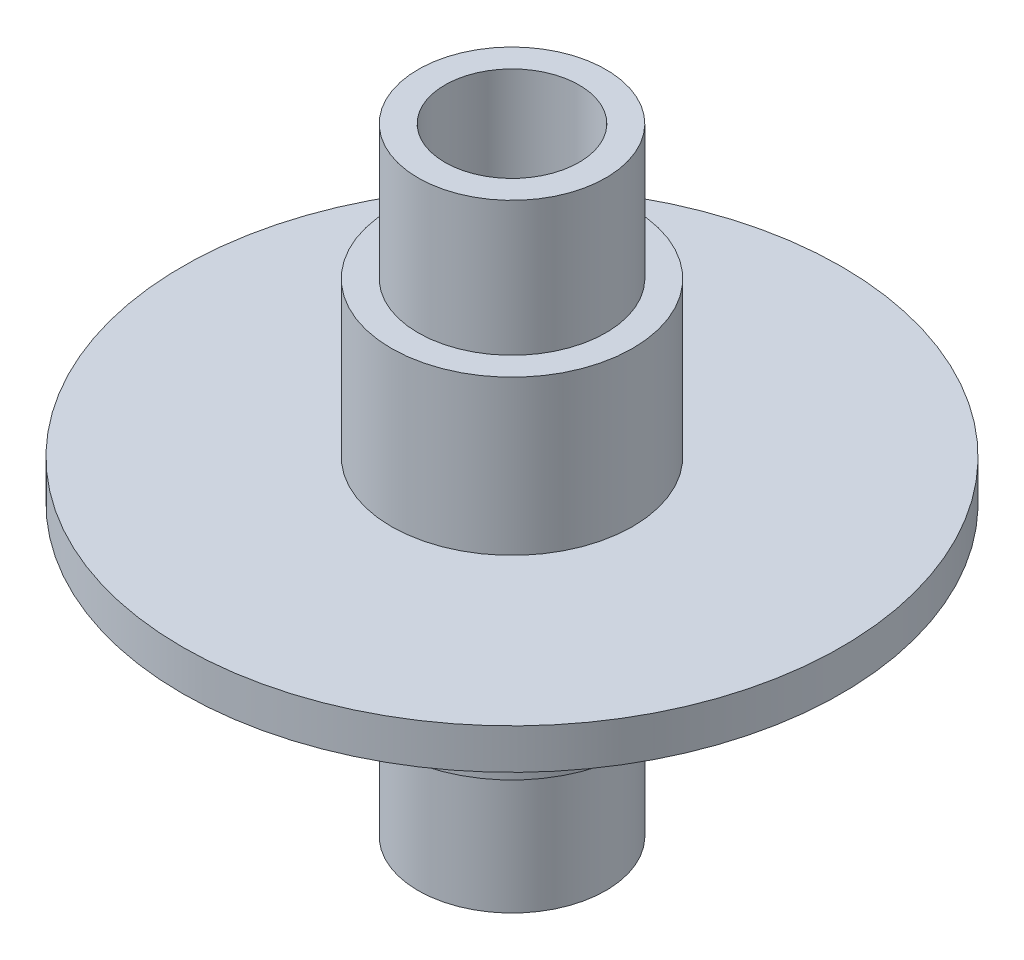
ISO-10303-21;
HEADER;
FILE_DESCRIPTION(('STEP AP214'),'2;1');
FILE_NAME('part.step','',(''),(''),'','','');
FILE_SCHEMA(('AUTOMOTIVE_DESIGN { 1 0 10303 214 1 1 1 1 }'));
ENDSEC;
DATA;
#1=APPLICATION_CONTEXT('core data for automotive mechanical design processes');
#2=APPLICATION_PROTOCOL_DEFINITION('international standard','automotive_design',2000,#1);
#3=PRODUCT_CONTEXT('',#1,'mechanical');
#4=PRODUCT('Part','Part','',(#3));
#5=PRODUCT_RELATED_PRODUCT_CATEGORY('part','',(#4));
#6=PRODUCT_DEFINITION_FORMATION('','',#4);
#7=PRODUCT_DEFINITION_CONTEXT('part definition',#1,'design');
#8=PRODUCT_DEFINITION('design','',#6,#7);
#9=PRODUCT_DEFINITION_SHAPE('','',#8);
#10=(LENGTH_UNIT() NAMED_UNIT(*) SI_UNIT(.MILLI.,.METRE.));
#11=(NAMED_UNIT(*) PLANE_ANGLE_UNIT() SI_UNIT($,.RADIAN.));
#12=(NAMED_UNIT(*) SI_UNIT($,.STERADIAN.) SOLID_ANGLE_UNIT());
#13=UNCERTAINTY_MEASURE_WITH_UNIT(LENGTH_MEASURE(1.E-05),#10,'distance_accuracy_value','');
#14=(GEOMETRIC_REPRESENTATION_CONTEXT(3) GLOBAL_UNCERTAINTY_ASSIGNED_CONTEXT((#13)) GLOBAL_UNIT_ASSIGNED_CONTEXT((#10,
#11,#12)) REPRESENTATION_CONTEXT('',''));
#15=CARTESIAN_POINT('',(0.,0.,0.));
#16=DIRECTION('',(0.,0.,1.));
#17=DIRECTION('',(1.,0.,0.));
#18=AXIS2_PLACEMENT_3D('',#15,#16,#17);
#19=CARTESIAN_POINT('',(-4.99999999999999,14.7062706270627,0.));
#20=DIRECTION('',(0.,1.,0.));
#21=DIRECTION('',(0.,0.,1.));
#22=AXIS2_PLACEMENT_3D('',#19,#20,#21);
#23=PLANE('',#22);
#24=CARTESIAN_POINT('',(0.,14.7062706270627,0.));
#25=DIRECTION('',(0.,1.,0.));
#26=DIRECTION('',(0.,0.,1.));
#27=AXIS2_PLACEMENT_3D('',#24,#25,#26);
#28=CIRCLE('',#27,7.);
#29=CARTESIAN_POINT('',(0.,14.7062706270627,7.));
#30=VERTEX_POINT('',#29);
#31=EDGE_CURVE('E10',#30,#30,#28,.T.);
#32=ORIENTED_EDGE('',*,*,#31,.T.);
#33=EDGE_LOOP('',(#32));
#34=FACE_BOUND('',#33,.T.);
#35=CARTESIAN_POINT('',(0.,14.7062706270627,0.));
#36=DIRECTION('',(0.,1.,0.));
#37=DIRECTION('',(0.,0.,1.));
#38=AXIS2_PLACEMENT_3D('',#35,#36,#37);
#39=CIRCLE('',#38,4.99999999999999);
#40=CARTESIAN_POINT('',(0.,14.7062706270627,4.99999999999999));
#41=VERTEX_POINT('',#40);
#42=EDGE_CURVE('E88',#41,#41,#39,.T.);
#43=ORIENTED_EDGE('',*,*,#42,.F.);
#44=EDGE_LOOP('',(#43));
#45=FACE_BOUND('',#44,.T.);
#46=ADVANCED_FACE('F37',(#34,#45),#23,.T.);
#47=CARTESIAN_POINT('',(0.,17.7244224422442,0.));
#48=DIRECTION('',(0.,1.,0.));
#49=DIRECTION('',(0.,0.,1.));
#50=AXIS2_PLACEMENT_3D('',#47,#48,#49);
#51=CYLINDRICAL_SURFACE('',#50,7.);
#52=CARTESIAN_POINT('',(0.,4.7062706270627,0.));
#53=DIRECTION('',(0.,1.,0.));
#54=DIRECTION('',(0.,0.,1.));
#55=AXIS2_PLACEMENT_3D('',#52,#53,#54);
#56=CIRCLE('',#55,7.);
#57=CARTESIAN_POINT('',(0.,4.7062706270627,7.));
#58=VERTEX_POINT('',#57);
#59=EDGE_CURVE('E44',#58,#58,#56,.T.);
#60=ORIENTED_EDGE('',*,*,#59,.T.);
#61=EDGE_LOOP('',(#60));
#62=FACE_BOUND('',#61,.T.);
#63=ORIENTED_EDGE('',*,*,#31,.F.);
#64=EDGE_LOOP('',(#63));
#65=FACE_BOUND('',#64,.T.);
#66=ADVANCED_FACE('F97',(#62,#65),#51,.T.);
#67=CARTESIAN_POINT('',(-7.,4.7062706270627,0.));
#68=DIRECTION('',(0.,1.,0.));
#69=DIRECTION('',(0.,0.,1.));
#70=AXIS2_PLACEMENT_3D('',#67,#68,#69);
#71=PLANE('',#70);
#72=CARTESIAN_POINT('',(0.,4.7062706270627,0.));
#73=DIRECTION('',(0.,1.,0.));
#74=DIRECTION('',(0.,0.,1.));
#75=AXIS2_PLACEMENT_3D('',#72,#73,#74);
#76=CIRCLE('',#75,9.);
#77=CARTESIAN_POINT('',(0.,4.7062706270627,9.));
#78=VERTEX_POINT('',#77);
#79=EDGE_CURVE('E49',#78,#78,#76,.T.);
#80=ORIENTED_EDGE('',*,*,#79,.T.);
#81=EDGE_LOOP('',(#80));
#82=FACE_BOUND('',#81,.T.);
#83=ORIENTED_EDGE('',*,*,#59,.F.);
#84=EDGE_LOOP('',(#83));
#85=FACE_BOUND('',#84,.T.);
#86=ADVANCED_FACE('F101',(#82,#85),#71,.T.);
#87=CARTESIAN_POINT('',(0.,17.7244224422442,0.));
#88=DIRECTION('',(0.,1.,0.));
#89=DIRECTION('',(0.,0.,1.));
#90=AXIS2_PLACEMENT_3D('',#87,#88,#89);
#91=CYLINDRICAL_SURFACE('',#90,9.);
#92=CARTESIAN_POINT('',(0.,-6.79372937293729,0.));
#93=DIRECTION('',(0.,1.,0.));
#94=DIRECTION('',(0.,0.,1.));
#95=AXIS2_PLACEMENT_3D('',#92,#93,#94);
#96=CIRCLE('',#95,9.);
#97=CARTESIAN_POINT('',(0.,-6.79372937293729,9.));
#98=VERTEX_POINT('',#97);
#99=EDGE_CURVE('E54',#98,#98,#96,.T.);
#100=ORIENTED_EDGE('',*,*,#99,.T.);
#101=EDGE_LOOP('',(#100));
#102=FACE_BOUND('',#101,.T.);
#103=ORIENTED_EDGE('',*,*,#79,.F.);
#104=EDGE_LOOP('',(#103));
#105=FACE_BOUND('',#104,.T.);
#106=ADVANCED_FACE('F105',(#102,#105),#91,.T.);
#107=CARTESIAN_POINT('',(-9.,-6.79372937293729,0.));
#108=DIRECTION('',(0.,1.,0.));
#109=DIRECTION('',(0.,0.,1.));
#110=AXIS2_PLACEMENT_3D('',#107,#108,#109);
#111=PLANE('',#110);
#112=CARTESIAN_POINT('',(0.,-6.79372937293729,0.));
#113=DIRECTION('',(0.,1.,0.));
#114=DIRECTION('',(0.,0.,1.));
#115=AXIS2_PLACEMENT_3D('',#112,#113,#114);
#116=CIRCLE('',#115,24.5610561056106);
#117=CARTESIAN_POINT('',(0.,-6.79372937293729,24.5610561056106));
#118=VERTEX_POINT('',#117);
#119=EDGE_CURVE('E60',#118,#118,#116,.T.);
#120=ORIENTED_EDGE('',*,*,#119,.T.);
#121=EDGE_LOOP('',(#120));
#122=FACE_BOUND('',#121,.T.);
#123=ORIENTED_EDGE('',*,*,#99,.F.);
#124=EDGE_LOOP('',(#123));
#125=FACE_BOUND('',#124,.T.);
#126=ADVANCED_FACE('F112',(#122,#125),#111,.T.);
#127=CARTESIAN_POINT('',(0.,17.7244224422442,0.));
#128=DIRECTION('',(0.,1.,0.));
#129=DIRECTION('',(0.,0.,1.));
#130=AXIS2_PLACEMENT_3D('',#127,#128,#129);
#131=CYLINDRICAL_SURFACE('',#130,24.5610561056106);
#132=CARTESIAN_POINT('',(0.,-9.7937293729373,0.));
#133=DIRECTION('',(0.,1.,0.));
#134=DIRECTION('',(0.,0.,1.));
#135=AXIS2_PLACEMENT_3D('',#132,#133,#134);
#136=CIRCLE('',#135,24.5610561056106);
#137=CARTESIAN_POINT('',(0.,-9.7937293729373,24.5610561056106));
#138=VERTEX_POINT('',#137);
#139=EDGE_CURVE('E64',#138,#138,#136,.T.);
#140=ORIENTED_EDGE('',*,*,#139,.T.);
#141=EDGE_LOOP('',(#140));
#142=FACE_BOUND('',#141,.T.);
#143=ORIENTED_EDGE('',*,*,#119,.F.);
#144=EDGE_LOOP('',(#143));
#145=FACE_BOUND('',#144,.T.);
#146=ADVANCED_FACE('F116',(#142,#145),#131,.T.);
#147=CARTESIAN_POINT('',(-9.,-9.7937293729373,0.));
#148=DIRECTION('',(0.,-1.,0.));
#149=DIRECTION('',(0.,0.,-1.));
#150=AXIS2_PLACEMENT_3D('',#147,#148,#149);
#151=PLANE('',#150);
#152=CARTESIAN_POINT('',(0.,-9.79372937293729,0.));
#153=DIRECTION('',(0.,1.,0.));
#154=DIRECTION('',(0.,0.,1.));
#155=AXIS2_PLACEMENT_3D('',#152,#153,#154);
#156=CIRCLE('',#155,9.);
#157=CARTESIAN_POINT('',(0.,-9.79372937293729,9.));
#158=VERTEX_POINT('',#157);
#159=EDGE_CURVE('E68',#158,#158,#156,.T.);
#160=ORIENTED_EDGE('',*,*,#159,.T.);
#161=EDGE_LOOP('',(#160));
#162=FACE_BOUND('',#161,.T.);
#163=ORIENTED_EDGE('',*,*,#139,.F.);
#164=EDGE_LOOP('',(#163));
#165=FACE_BOUND('',#164,.T.);
#166=ADVANCED_FACE('F120',(#162,#165),#151,.T.);
#167=CARTESIAN_POINT('',(0.,17.7244224422442,0.));
#168=DIRECTION('',(0.,1.,0.));
#169=DIRECTION('',(0.,0.,1.));
#170=AXIS2_PLACEMENT_3D('',#167,#168,#169);
#171=CYLINDRICAL_SURFACE('',#170,9.);
#172=CARTESIAN_POINT('',(0.,-21.2937293729373,0.));
#173=DIRECTION('',(0.,1.,0.));
#174=DIRECTION('',(0.,0.,1.));
#175=AXIS2_PLACEMENT_3D('',#172,#173,#174);
#176=CIRCLE('',#175,9.);
#177=CARTESIAN_POINT('',(0.,-21.2937293729373,9.));
#178=VERTEX_POINT('',#177);
#179=EDGE_CURVE('E72',#178,#178,#176,.T.);
#180=ORIENTED_EDGE('',*,*,#179,.T.);
#181=EDGE_LOOP('',(#180));
#182=FACE_BOUND('',#181,.T.);
#183=ORIENTED_EDGE('',*,*,#159,.F.);
#184=EDGE_LOOP('',(#183));
#185=FACE_BOUND('',#184,.T.);
#186=ADVANCED_FACE('F124',(#182,#185),#171,.T.);
#187=CARTESIAN_POINT('',(-7.00000000000001,-21.2937293729373,0.));
#188=DIRECTION('',(0.,-1.,0.));
#189=DIRECTION('',(0.,0.,-1.));
#190=AXIS2_PLACEMENT_3D('',#187,#188,#189);
#191=PLANE('',#190);
#192=CARTESIAN_POINT('',(0.,-21.2937293729373,0.));
#193=DIRECTION('',(0.,1.,0.));
#194=DIRECTION('',(0.,0.,1.));
#195=AXIS2_PLACEMENT_3D('',#192,#193,#194);
#196=CIRCLE('',#195,7.00000000000001);
#197=CARTESIAN_POINT('',(0.,-21.2937293729373,7.00000000000001));
#198=VERTEX_POINT('',#197);
#199=EDGE_CURVE('E76',#198,#198,#196,.T.);
#200=ORIENTED_EDGE('',*,*,#199,.T.);
#201=EDGE_LOOP('',(#200));
#202=FACE_BOUND('',#201,.T.);
#203=ORIENTED_EDGE('',*,*,#179,.F.);
#204=EDGE_LOOP('',(#203));
#205=FACE_BOUND('',#204,.T.);
#206=ADVANCED_FACE('F128',(#202,#205),#191,.T.);
#207=CARTESIAN_POINT('',(0.,17.7244224422442,0.));
#208=DIRECTION('',(0.,1.,0.));
#209=DIRECTION('',(0.,0.,1.));
#210=AXIS2_PLACEMENT_3D('',#207,#208,#209);
#211=CYLINDRICAL_SURFACE('',#210,7.00000000000001);
#212=CARTESIAN_POINT('',(0.,-31.2937293729373,0.));
#213=DIRECTION('',(0.,1.,0.));
#214=DIRECTION('',(0.,0.,1.));
#215=AXIS2_PLACEMENT_3D('',#212,#213,#214);
#216=CIRCLE('',#215,7.00000000000001);
#217=CARTESIAN_POINT('',(0.,-31.2937293729373,7.00000000000001));
#218=VERTEX_POINT('',#217);
#219=EDGE_CURVE('E80',#218,#218,#216,.T.);
#220=ORIENTED_EDGE('',*,*,#219,.T.);
#221=EDGE_LOOP('',(#220));
#222=FACE_BOUND('',#221,.T.);
#223=ORIENTED_EDGE('',*,*,#199,.F.);
#224=EDGE_LOOP('',(#223));
#225=FACE_BOUND('',#224,.T.);
#226=ADVANCED_FACE('F132',(#222,#225),#211,.T.);
#227=CARTESIAN_POINT('',(-5.,-31.2937293729373,0.));
#228=DIRECTION('',(0.,-1.,0.));
#229=DIRECTION('',(0.,0.,-1.));
#230=AXIS2_PLACEMENT_3D('',#227,#228,#229);
#231=PLANE('',#230);
#232=CARTESIAN_POINT('',(0.,-31.2937293729373,0.));
#233=DIRECTION('',(0.,1.,0.));
#234=DIRECTION('',(0.,0.,1.));
#235=AXIS2_PLACEMENT_3D('',#232,#233,#234);
#236=CIRCLE('',#235,5.);
#237=CARTESIAN_POINT('',(0.,-31.2937293729373,5.));
#238=VERTEX_POINT('',#237);
#239=EDGE_CURVE('E84',#238,#238,#236,.T.);
#240=ORIENTED_EDGE('',*,*,#239,.T.);
#241=EDGE_LOOP('',(#240));
#242=FACE_BOUND('',#241,.T.);
#243=ORIENTED_EDGE('',*,*,#219,.F.);
#244=EDGE_LOOP('',(#243));
#245=FACE_BOUND('',#244,.T.);
#246=ADVANCED_FACE('F136',(#242,#245),#231,.T.);
#247=CARTESIAN_POINT('',(0.,17.7244224422442,0.));
#248=DIRECTION('',(0.,1.,0.));
#249=DIRECTION('',(0.,0.,1.));
#250=AXIS2_PLACEMENT_3D('',#247,#248,#249);
#251=CYLINDRICAL_SURFACE('',#250,5.);
#252=ORIENTED_EDGE('',*,*,#42,.T.);
#253=EDGE_LOOP('',(#252));
#254=FACE_BOUND('',#253,.T.);
#255=ORIENTED_EDGE('',*,*,#239,.F.);
#256=EDGE_LOOP('',(#255));
#257=FACE_BOUND('',#256,.T.);
#258=ADVANCED_FACE('F93',(#254,#257),#251,.F.);
#259=CLOSED_SHELL('',(#46,#66,#86,#106,#126,#146,#166,#186,#206,#226,#246,#258));
#260=MANIFOLD_SOLID_BREP('B2',#259);
#261=ADVANCED_BREP_SHAPE_REPRESENTATION('',(#18,#260),#14);
#262=SHAPE_DEFINITION_REPRESENTATION(#9,#261);
ENDSEC;
END-ISO-10303-21;
